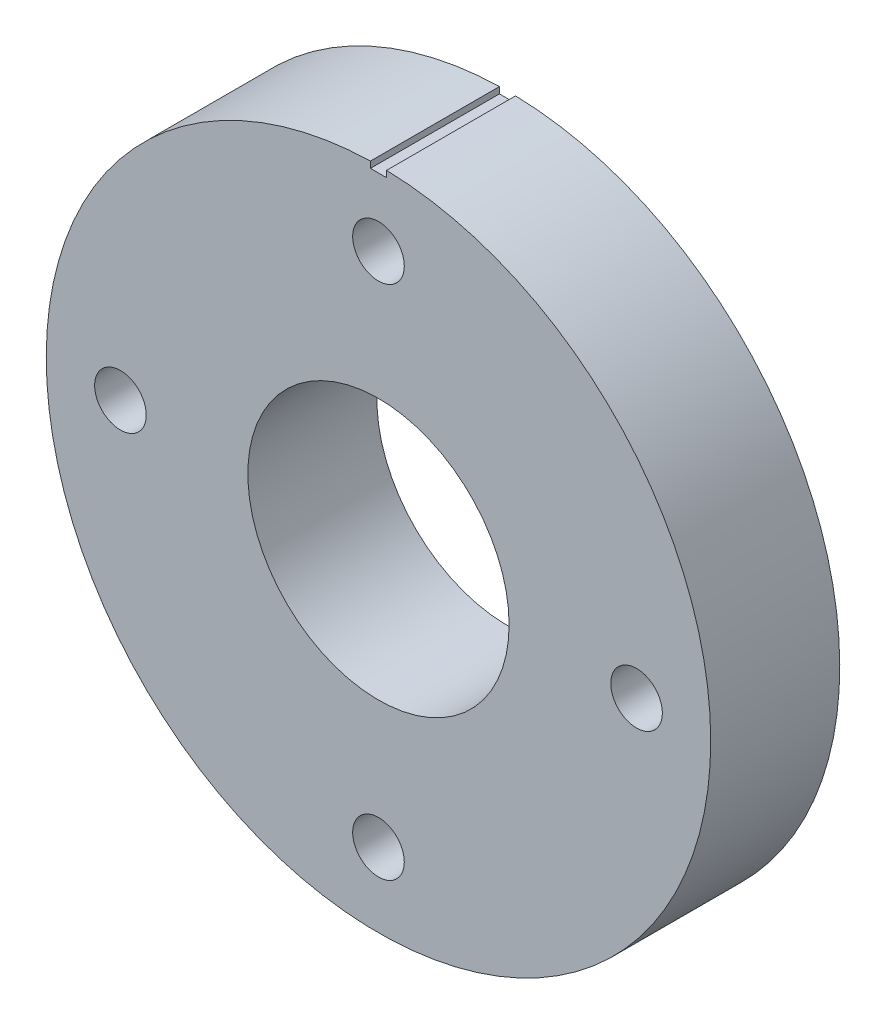
ISO-10303-21;
HEADER;
FILE_DESCRIPTION(('STEP AP214'),'2;1');
FILE_NAME('part.step','',(''),(''),'','','');
FILE_SCHEMA(('AUTOMOTIVE_DESIGN { 1 0 10303 214 1 1 1 1 }'));
ENDSEC;
DATA;
#1=APPLICATION_CONTEXT('core data for automotive mechanical design processes');
#2=APPLICATION_PROTOCOL_DEFINITION('international standard','automotive_design',2000,#1);
#3=PRODUCT_CONTEXT('',#1,'mechanical');
#4=PRODUCT('Part','Part','',(#3));
#5=PRODUCT_RELATED_PRODUCT_CATEGORY('part','',(#4));
#6=PRODUCT_DEFINITION_FORMATION('','',#4);
#7=PRODUCT_DEFINITION_CONTEXT('part definition',#1,'design');
#8=PRODUCT_DEFINITION('design','',#6,#7);
#9=PRODUCT_DEFINITION_SHAPE('','',#8);
#10=(LENGTH_UNIT() NAMED_UNIT(*) SI_UNIT(.MILLI.,.METRE.));
#11=(NAMED_UNIT(*) PLANE_ANGLE_UNIT() SI_UNIT($,.RADIAN.));
#12=(NAMED_UNIT(*) SI_UNIT($,.STERADIAN.) SOLID_ANGLE_UNIT());
#13=UNCERTAINTY_MEASURE_WITH_UNIT(LENGTH_MEASURE(1.E-05),#10,'distance_accuracy_value','');
#14=(GEOMETRIC_REPRESENTATION_CONTEXT(3) GLOBAL_UNCERTAINTY_ASSIGNED_CONTEXT((#13)) GLOBAL_UNIT_ASSIGNED_CONTEXT((#10,
#11,#12)) REPRESENTATION_CONTEXT('',''));
#15=CARTESIAN_POINT('',(0.,0.,0.));
#16=DIRECTION('',(0.,0.,1.));
#17=DIRECTION('',(1.,0.,0.));
#18=AXIS2_PLACEMENT_3D('',#15,#16,#17);
#19=CARTESIAN_POINT('',(2.46695752660115E-13,-11.,4.));
#20=DIRECTION('',(0.,0.,1.));
#21=DIRECTION('',(1.,0.,0.));
#22=AXIS2_PLACEMENT_3D('',#19,#20,#21);
#23=PLANE('',#22);
#24=CARTESIAN_POINT('',(8.00000000000025,-11.,4.));
#25=DIRECTION('',(0.,0.,1.));
#26=DIRECTION('',(1.,0.,0.));
#27=AXIS2_PLACEMENT_3D('',#24,#25,#26);
#28=CIRCLE('',#27,0.8);
#29=CARTESIAN_POINT('',(8.80000000000025,-11.,4.));
#30=VERTEX_POINT('',#29);
#31=EDGE_CURVE('E133',#30,#30,#28,.T.);
#32=ORIENTED_EDGE('',*,*,#31,.F.);
#33=EDGE_LOOP('',(#32));
#34=FACE_BOUND('',#33,.T.);
#35=CARTESIAN_POINT('',(2.46695752660115E-13,-3.,4.));
#36=DIRECTION('',(0.,0.,1.));
#37=DIRECTION('',(1.,0.,0.));
#38=AXIS2_PLACEMENT_3D('',#35,#36,#37);
#39=CIRCLE('',#38,0.799999999999989);
#40=CARTESIAN_POINT('',(0.800000000000236,-3.,4.));
#41=VERTEX_POINT('',#40);
#42=EDGE_CURVE('E123',#41,#41,#39,.T.);
#43=ORIENTED_EDGE('',*,*,#42,.F.);
#44=EDGE_LOOP('',(#43));
#45=FACE_BOUND('',#44,.T.);
#46=DIRECTION('',(-1.,0.,0.));
#47=VECTOR('',#46,1.);
#48=CARTESIAN_POINT('',(0.250000000000247,-0.9,4.));
#49=LINE('',#48,#47);
#50=CARTESIAN_POINT('',(0.250000000000247,-0.9,4.));
#51=VERTEX_POINT('',#50);
#52=CARTESIAN_POINT('',(-0.249999999999753,-0.9,4.));
#53=VERTEX_POINT('',#52);
#54=EDGE_CURVE('E89',#51,#53,#49,.T.);
#55=ORIENTED_EDGE('',*,*,#54,.T.);
#56=DIRECTION('',(0.,1.,0.));
#57=VECTOR('',#56,1.);
#58=CARTESIAN_POINT('',(-0.249999999999753,-0.9,4.));
#59=LINE('',#58,#57);
#60=CARTESIAN_POINT('',(-0.249999999999753,-0.703034427560702,4.));
#61=VERTEX_POINT('',#60);
#62=EDGE_CURVE('E82',#53,#61,#59,.T.);
#63=ORIENTED_EDGE('',*,*,#62,.T.);
#64=CARTESIAN_POINT('',(2.46695752660115E-13,-11.,4.));
#65=DIRECTION('',(0.,0.,1.));
#66=DIRECTION('',(1.,0.,0.));
#67=AXIS2_PLACEMENT_3D('',#64,#65,#66);
#68=CIRCLE('',#67,10.3);
#69=CARTESIAN_POINT('',(0.250000000000248,-0.703034427560707,4.));
#70=VERTEX_POINT('',#69);
#71=EDGE_CURVE('E88',#61,#70,#68,.T.);
#72=ORIENTED_EDGE('',*,*,#71,.T.);
#73=DIRECTION('',(0.,-1.,0.));
#74=VECTOR('',#73,1.);
#75=CARTESIAN_POINT('',(0.250000000000248,-0.703034427560706,4.));
#76=LINE('',#75,#74);
#77=EDGE_CURVE('E57',#70,#51,#76,.T.);
#78=ORIENTED_EDGE('',*,*,#77,.T.);
#79=EDGE_LOOP('',(#55,#63,#72,#78));
#80=FACE_BOUND('',#79,.T.);
#81=CARTESIAN_POINT('',(-7.99999999999975,-11.,4.));
#82=DIRECTION('',(0.,0.,1.));
#83=DIRECTION('',(1.,0.,0.));
#84=AXIS2_PLACEMENT_3D('',#81,#82,#83);
#85=CIRCLE('',#84,0.8);
#86=CARTESIAN_POINT('',(-7.19999999999975,-11.,4.));
#87=VERTEX_POINT('',#86);
#88=EDGE_CURVE('E107',#87,#87,#85,.T.);
#89=ORIENTED_EDGE('',*,*,#88,.F.);
#90=EDGE_LOOP('',(#89));
#91=FACE_BOUND('',#90,.T.);
#92=CARTESIAN_POINT('',(2.46695752660115E-13,-19.,4.));
#93=DIRECTION('',(0.,0.,1.));
#94=DIRECTION('',(1.,0.,0.));
#95=AXIS2_PLACEMENT_3D('',#92,#93,#94);
#96=CIRCLE('',#95,0.799999999999989);
#97=CARTESIAN_POINT('',(0.800000000000236,-19.,4.));
#98=VERTEX_POINT('',#97);
#99=EDGE_CURVE('E130',#98,#98,#96,.T.);
#100=ORIENTED_EDGE('',*,*,#99,.F.);
#101=EDGE_LOOP('',(#100));
#102=FACE_BOUND('',#101,.T.);
#103=CARTESIAN_POINT('',(2.46695752660115E-13,-11.,4.));
#104=DIRECTION('',(0.,0.,1.));
#105=DIRECTION('',(1.,0.,0.));
#106=AXIS2_PLACEMENT_3D('',#103,#104,#105);
#107=CIRCLE('',#106,4.05);
#108=CARTESIAN_POINT('',(4.05000000000025,-11.,4.));
#109=VERTEX_POINT('',#108);
#110=EDGE_CURVE('E137',#109,#109,#107,.T.);
#111=ORIENTED_EDGE('',*,*,#110,.F.);
#112=EDGE_LOOP('',(#111));
#113=FACE_BOUND('',#112,.T.);
#114=ADVANCED_FACE('F39',(#34,#45,#80,#91,#102,#113),#23,.T.);
#115=CARTESIAN_POINT('',(2.46695752660115E-13,-11.,0.));
#116=DIRECTION('',(0.,0.,1.));
#117=DIRECTION('',(1.,0.,0.));
#118=AXIS2_PLACEMENT_3D('',#115,#116,#117);
#119=PLANE('',#118);
#120=DIRECTION('',(-1.,0.,0.));
#121=VECTOR('',#120,1.);
#122=CARTESIAN_POINT('',(0.250000000000247,-0.9,0.));
#123=LINE('',#122,#121);
#124=CARTESIAN_POINT('',(0.250000000000247,-0.9,0.));
#125=VERTEX_POINT('',#124);
#126=CARTESIAN_POINT('',(-0.249999999999753,-0.9,0.));
#127=VERTEX_POINT('',#126);
#128=EDGE_CURVE('E104',#125,#127,#123,.T.);
#129=ORIENTED_EDGE('',*,*,#128,.F.);
#130=DIRECTION('',(0.,-1.,0.));
#131=VECTOR('',#130,1.);
#132=CARTESIAN_POINT('',(0.250000000000248,-0.703034427560706,0.));
#133=LINE('',#132,#131);
#134=CARTESIAN_POINT('',(0.250000000000248,-0.703034427560707,0.));
#135=VERTEX_POINT('',#134);
#136=EDGE_CURVE('E76',#135,#125,#133,.T.);
#137=ORIENTED_EDGE('',*,*,#136,.F.);
#138=CARTESIAN_POINT('',(2.46695752660115E-13,-11.,0.));
#139=DIRECTION('',(0.,0.,1.));
#140=DIRECTION('',(1.,0.,0.));
#141=AXIS2_PLACEMENT_3D('',#138,#139,#140);
#142=CIRCLE('',#141,10.3);
#143=CARTESIAN_POINT('',(-0.249999999999753,-0.703034427560702,0.));
#144=VERTEX_POINT('',#143);
#145=EDGE_CURVE('E74',#144,#135,#142,.T.);
#146=ORIENTED_EDGE('',*,*,#145,.F.);
#147=DIRECTION('',(0.,1.,0.));
#148=VECTOR('',#147,1.);
#149=CARTESIAN_POINT('',(-0.249999999999753,-0.9,0.));
#150=LINE('',#149,#148);
#151=EDGE_CURVE('E94',#127,#144,#150,.T.);
#152=ORIENTED_EDGE('',*,*,#151,.F.);
#153=EDGE_LOOP('',(#129,#137,#146,#152));
#154=FACE_BOUND('',#153,.T.);
#155=CARTESIAN_POINT('',(-7.99999999999975,-11.,0.));
#156=DIRECTION('',(0.,0.,1.));
#157=DIRECTION('',(1.,0.,0.));
#158=AXIS2_PLACEMENT_3D('',#155,#156,#157);
#159=CIRCLE('',#158,0.8);
#160=CARTESIAN_POINT('',(-7.19999999999975,-11.,0.));
#161=VERTEX_POINT('',#160);
#162=EDGE_CURVE('E120',#161,#161,#159,.T.);
#163=ORIENTED_EDGE('',*,*,#162,.T.);
#164=EDGE_LOOP('',(#163));
#165=FACE_BOUND('',#164,.T.);
#166=CARTESIAN_POINT('',(2.46695752660115E-13,-3.,0.));
#167=DIRECTION('',(0.,0.,1.));
#168=DIRECTION('',(1.,0.,0.));
#169=AXIS2_PLACEMENT_3D('',#166,#167,#168);
#170=CIRCLE('',#169,0.799999999999989);
#171=CARTESIAN_POINT('',(0.800000000000236,-3.,0.));
#172=VERTEX_POINT('',#171);
#173=EDGE_CURVE('E125',#172,#172,#170,.T.);
#174=ORIENTED_EDGE('',*,*,#173,.T.);
#175=EDGE_LOOP('',(#174));
#176=FACE_BOUND('',#175,.T.);
#177=CARTESIAN_POINT('',(2.46695752660115E-13,-19.,0.));
#178=DIRECTION('',(0.,0.,1.));
#179=DIRECTION('',(1.,0.,0.));
#180=AXIS2_PLACEMENT_3D('',#177,#178,#179);
#181=CIRCLE('',#180,0.799999999999989);
#182=CARTESIAN_POINT('',(0.800000000000236,-19.,0.));
#183=VERTEX_POINT('',#182);
#184=EDGE_CURVE('E127',#183,#183,#181,.T.);
#185=ORIENTED_EDGE('',*,*,#184,.T.);
#186=EDGE_LOOP('',(#185));
#187=FACE_BOUND('',#186,.T.);
#188=CARTESIAN_POINT('',(8.00000000000025,-11.,0.));
#189=DIRECTION('',(0.,0.,1.));
#190=DIRECTION('',(1.,0.,0.));
#191=AXIS2_PLACEMENT_3D('',#188,#189,#190);
#192=CIRCLE('',#191,0.8);
#193=CARTESIAN_POINT('',(8.80000000000025,-11.,0.));
#194=VERTEX_POINT('',#193);
#195=EDGE_CURVE('E136',#194,#194,#192,.T.);
#196=ORIENTED_EDGE('',*,*,#195,.T.);
#197=EDGE_LOOP('',(#196));
#198=FACE_BOUND('',#197,.T.);
#199=CARTESIAN_POINT('',(2.46695752660115E-13,-11.,0.));
#200=DIRECTION('',(0.,0.,1.));
#201=DIRECTION('',(1.,0.,0.));
#202=AXIS2_PLACEMENT_3D('',#199,#200,#201);
#203=CIRCLE('',#202,4.05);
#204=CARTESIAN_POINT('',(4.05000000000025,-11.,0.));
#205=VERTEX_POINT('',#204);
#206=EDGE_CURVE('E145',#205,#205,#203,.T.);
#207=ORIENTED_EDGE('',*,*,#206,.T.);
#208=EDGE_LOOP('',(#207));
#209=FACE_BOUND('',#208,.T.);
#210=ADVANCED_FACE('F114',(#154,#165,#176,#187,#198,#209),#119,.F.);
#211=CARTESIAN_POINT('',(0.250000000000247,-0.9,4.));
#212=DIRECTION('',(0.,-1.,0.));
#213=DIRECTION('',(0.,0.,-1.));
#214=AXIS2_PLACEMENT_3D('',#211,#212,#213);
#215=PLANE('',#214);
#216=ORIENTED_EDGE('',*,*,#128,.T.);
#217=DIRECTION('',(0.,0.,-1.));
#218=VECTOR('',#217,1.);
#219=CARTESIAN_POINT('',(-0.249999999999753,-0.9,4.));
#220=LINE('',#219,#218);
#221=EDGE_CURVE('E11',#53,#127,#220,.T.);
#222=ORIENTED_EDGE('',*,*,#221,.F.);
#223=ORIENTED_EDGE('',*,*,#54,.F.);
#224=DIRECTION('',(0.,0.,-1.));
#225=VECTOR('',#224,1.);
#226=CARTESIAN_POINT('',(0.250000000000247,-0.9,4.));
#227=LINE('',#226,#225);
#228=EDGE_CURVE('E98',#51,#125,#227,.T.);
#229=ORIENTED_EDGE('',*,*,#228,.T.);
#230=EDGE_LOOP('',(#216,#222,#223,#229));
#231=FACE_BOUND('',#230,.T.);
#232=ADVANCED_FACE('F41',(#231),#215,.F.);
#233=CARTESIAN_POINT('',(-0.249999999999753,-0.9,4.));
#234=DIRECTION('',(-1.,0.,0.));
#235=DIRECTION('',(0.,0.,1.));
#236=AXIS2_PLACEMENT_3D('',#233,#234,#235);
#237=PLANE('',#236);
#238=ORIENTED_EDGE('',*,*,#151,.T.);
#239=DIRECTION('',(0.,0.,-1.));
#240=VECTOR('',#239,1.);
#241=CARTESIAN_POINT('',(-0.249999999999753,-0.703034427560702,4.));
#242=LINE('',#241,#240);
#243=EDGE_CURVE('E48',#61,#144,#242,.T.);
#244=ORIENTED_EDGE('',*,*,#243,.F.);
#245=ORIENTED_EDGE('',*,*,#62,.F.);
#246=ORIENTED_EDGE('',*,*,#221,.T.);
#247=EDGE_LOOP('',(#238,#244,#245,#246));
#248=FACE_BOUND('',#247,.T.);
#249=ADVANCED_FACE('F92',(#248),#237,.F.);
#250=CARTESIAN_POINT('',(2.46695752660115E-13,-11.,4.));
#251=DIRECTION('',(0.,0.,-1.));
#252=DIRECTION('',(-1.,0.,0.));
#253=AXIS2_PLACEMENT_3D('',#250,#251,#252);
#254=CYLINDRICAL_SURFACE('',#253,10.3);
#255=ORIENTED_EDGE('',*,*,#145,.T.);
#256=DIRECTION('',(0.,0.,-1.));
#257=VECTOR('',#256,1.);
#258=CARTESIAN_POINT('',(0.250000000000248,-0.703034427560707,4.));
#259=LINE('',#258,#257);
#260=EDGE_CURVE('E96',#70,#135,#259,.T.);
#261=ORIENTED_EDGE('',*,*,#260,.F.);
#262=ORIENTED_EDGE('',*,*,#71,.F.);
#263=ORIENTED_EDGE('',*,*,#243,.T.);
#264=EDGE_LOOP('',(#255,#261,#262,#263));
#265=FACE_BOUND('',#264,.T.);
#266=ADVANCED_FACE('F100',(#265),#254,.T.);
#267=CARTESIAN_POINT('',(0.250000000000248,-0.703034427560706,4.));
#268=DIRECTION('',(1.,0.,0.));
#269=DIRECTION('',(0.,1.,0.));
#270=AXIS2_PLACEMENT_3D('',#267,#268,#269);
#271=PLANE('',#270);
#272=ORIENTED_EDGE('',*,*,#136,.T.);
#273=ORIENTED_EDGE('',*,*,#228,.F.);
#274=ORIENTED_EDGE('',*,*,#77,.F.);
#275=ORIENTED_EDGE('',*,*,#260,.T.);
#276=EDGE_LOOP('',(#272,#273,#274,#275));
#277=FACE_BOUND('',#276,.T.);
#278=ADVANCED_FACE('F112',(#277),#271,.F.);
#279=CARTESIAN_POINT('',(-7.99999999999975,-11.,4.));
#280=DIRECTION('',(0.,0.,-1.));
#281=DIRECTION('',(-1.,0.,0.));
#282=AXIS2_PLACEMENT_3D('',#279,#280,#281);
#283=CYLINDRICAL_SURFACE('',#282,0.8);
#284=ORIENTED_EDGE('',*,*,#162,.F.);
#285=EDGE_LOOP('',(#284));
#286=FACE_BOUND('',#285,.T.);
#287=ORIENTED_EDGE('',*,*,#88,.T.);
#288=EDGE_LOOP('',(#287));
#289=FACE_BOUND('',#288,.T.);
#290=ADVANCED_FACE('F158',(#286,#289),#283,.F.);
#291=CARTESIAN_POINT('',(2.46695752660115E-13,-3.,4.));
#292=DIRECTION('',(0.,0.,-1.));
#293=DIRECTION('',(-1.,0.,0.));
#294=AXIS2_PLACEMENT_3D('',#291,#292,#293);
#295=CYLINDRICAL_SURFACE('',#294,0.799999999999989);
#296=ORIENTED_EDGE('',*,*,#173,.F.);
#297=EDGE_LOOP('',(#296));
#298=FACE_BOUND('',#297,.T.);
#299=ORIENTED_EDGE('',*,*,#42,.T.);
#300=EDGE_LOOP('',(#299));
#301=FACE_BOUND('',#300,.T.);
#302=ADVANCED_FACE('F209',(#298,#301),#295,.F.);
#303=CARTESIAN_POINT('',(2.46695752660115E-13,-19.,4.));
#304=DIRECTION('',(0.,0.,-1.));
#305=DIRECTION('',(-1.,0.,0.));
#306=AXIS2_PLACEMENT_3D('',#303,#304,#305);
#307=CYLINDRICAL_SURFACE('',#306,0.799999999999989);
#308=ORIENTED_EDGE('',*,*,#184,.F.);
#309=EDGE_LOOP('',(#308));
#310=FACE_BOUND('',#309,.T.);
#311=ORIENTED_EDGE('',*,*,#99,.T.);
#312=EDGE_LOOP('',(#311));
#313=FACE_BOUND('',#312,.T.);
#314=ADVANCED_FACE('F218',(#310,#313),#307,.F.);
#315=CARTESIAN_POINT('',(8.00000000000025,-11.,4.));
#316=DIRECTION('',(0.,0.,-1.));
#317=DIRECTION('',(-1.,0.,0.));
#318=AXIS2_PLACEMENT_3D('',#315,#316,#317);
#319=CYLINDRICAL_SURFACE('',#318,0.8);
#320=ORIENTED_EDGE('',*,*,#195,.F.);
#321=EDGE_LOOP('',(#320));
#322=FACE_BOUND('',#321,.T.);
#323=ORIENTED_EDGE('',*,*,#31,.T.);
#324=EDGE_LOOP('',(#323));
#325=FACE_BOUND('',#324,.T.);
#326=ADVANCED_FACE('F224',(#322,#325),#319,.F.);
#327=CARTESIAN_POINT('',(2.46695752660115E-13,-11.,4.));
#328=DIRECTION('',(0.,0.,-1.));
#329=DIRECTION('',(-1.,0.,0.));
#330=AXIS2_PLACEMENT_3D('',#327,#328,#329);
#331=CYLINDRICAL_SURFACE('',#330,4.05);
#332=ORIENTED_EDGE('',*,*,#206,.F.);
#333=EDGE_LOOP('',(#332));
#334=FACE_BOUND('',#333,.T.);
#335=ORIENTED_EDGE('',*,*,#110,.T.);
#336=EDGE_LOOP('',(#335));
#337=FACE_BOUND('',#336,.T.);
#338=ADVANCED_FACE('F149',(#334,#337),#331,.F.);
#339=CLOSED_SHELL('',(#114,#210,#232,#249,#266,#278,#290,#302,#314,#326,#338));
#340=MANIFOLD_SOLID_BREP('B2',#339);
#341=ADVANCED_BREP_SHAPE_REPRESENTATION('',(#18,#340),#14);
#342=SHAPE_DEFINITION_REPRESENTATION(#9,#341);
ENDSEC;
END-ISO-10303-21;
